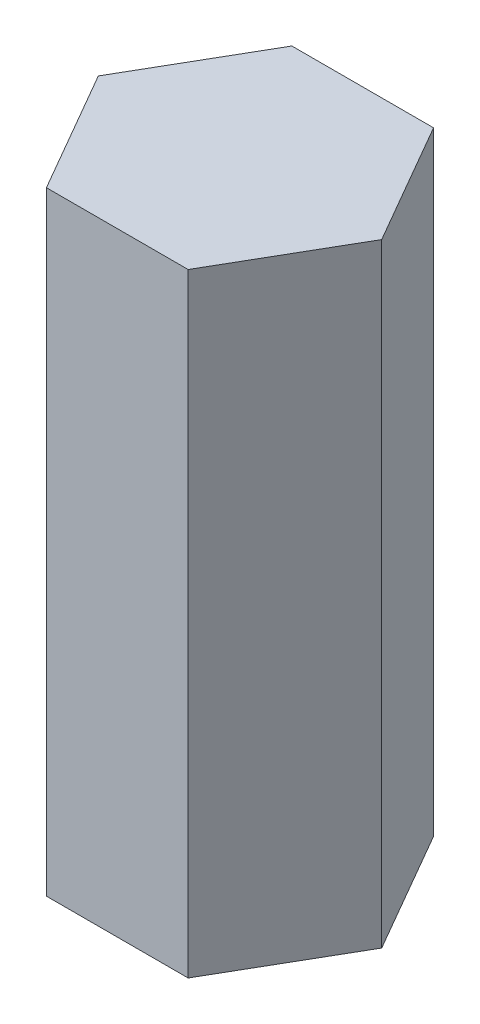
ISO-10303-21;
HEADER;
FILE_DESCRIPTION(('STEP AP214'),'2;1');
FILE_NAME('part.step','',(''),(''),'','','');
FILE_SCHEMA(('AUTOMOTIVE_DESIGN { 1 0 10303 214 1 1 1 1 }'));
ENDSEC;
DATA;
#1=APPLICATION_CONTEXT('core data for automotive mechanical design processes');
#2=APPLICATION_PROTOCOL_DEFINITION('international standard','automotive_design',2000,#1);
#3=PRODUCT_CONTEXT('',#1,'mechanical');
#4=PRODUCT('Part','Part','',(#3));
#5=PRODUCT_RELATED_PRODUCT_CATEGORY('part','',(#4));
#6=PRODUCT_DEFINITION_FORMATION('','',#4);
#7=PRODUCT_DEFINITION_CONTEXT('part definition',#1,'design');
#8=PRODUCT_DEFINITION('design','',#6,#7);
#9=PRODUCT_DEFINITION_SHAPE('','',#8);
#10=(LENGTH_UNIT() NAMED_UNIT(*) SI_UNIT(.MILLI.,.METRE.));
#11=(NAMED_UNIT(*) PLANE_ANGLE_UNIT() SI_UNIT($,.RADIAN.));
#12=(NAMED_UNIT(*) SI_UNIT($,.STERADIAN.) SOLID_ANGLE_UNIT());
#13=UNCERTAINTY_MEASURE_WITH_UNIT(LENGTH_MEASURE(1.E-05),#10,'distance_accuracy_value','');
#14=(GEOMETRIC_REPRESENTATION_CONTEXT(3) GLOBAL_UNCERTAINTY_ASSIGNED_CONTEXT((#13)) GLOBAL_UNIT_ASSIGNED_CONTEXT((#10,
#11,#12)) REPRESENTATION_CONTEXT('',''));
#15=CARTESIAN_POINT('',(0.,0.,0.));
#16=DIRECTION('',(0.,0.,1.));
#17=DIRECTION('',(1.,0.,0.));
#18=AXIS2_PLACEMENT_3D('',#15,#16,#17);
#19=CARTESIAN_POINT('',(3.46410161513775,15.,0.));
#20=DIRECTION('',(-0.866025403784439,0.,0.5));
#21=DIRECTION('',(0.5,0.,0.866025403784439));
#22=AXIS2_PLACEMENT_3D('',#19,#20,#21);
#23=PLANE('',#22);
#24=DIRECTION('',(-0.5,0.,-0.866025403784439));
#25=VECTOR('',#24,1.);
#26=CARTESIAN_POINT('',(3.46410161513775,0.,0.));
#27=LINE('',#26,#25);
#28=CARTESIAN_POINT('',(3.46410161513775,0.,0.));
#29=VERTEX_POINT('',#28);
#30=CARTESIAN_POINT('',(1.73205080756888,0.,-3.));
#31=VERTEX_POINT('',#30);
#32=EDGE_CURVE('E117',#29,#31,#27,.T.);
#33=ORIENTED_EDGE('',*,*,#32,.T.);
#34=DIRECTION('',(0.,-1.,0.));
#35=VECTOR('',#34,1.);
#36=CARTESIAN_POINT('',(1.73205080756888,15.,-3.));
#37=LINE('',#36,#35);
#38=CARTESIAN_POINT('',(1.73205080756888,15.,-3.));
#39=VERTEX_POINT('',#38);
#40=EDGE_CURVE('E11',#39,#31,#37,.T.);
#41=ORIENTED_EDGE('',*,*,#40,.F.);
#42=DIRECTION('',(-0.5,0.,-0.866025403784439));
#43=VECTOR('',#42,1.);
#44=CARTESIAN_POINT('',(3.46410161513775,15.,0.));
#45=LINE('',#44,#43);
#46=CARTESIAN_POINT('',(3.46410161513775,15.,0.));
#47=VERTEX_POINT('',#46);
#48=EDGE_CURVE('E127',#47,#39,#45,.T.);
#49=ORIENTED_EDGE('',*,*,#48,.F.);
#50=DIRECTION('',(0.,-1.,0.));
#51=VECTOR('',#50,1.);
#52=CARTESIAN_POINT('',(3.46410161513775,15.,0.));
#53=LINE('',#52,#51);
#54=EDGE_CURVE('E113',#47,#29,#53,.T.);
#55=ORIENTED_EDGE('',*,*,#54,.T.);
#56=EDGE_LOOP('',(#33,#41,#49,#55));
#57=FACE_BOUND('',#56,.T.);
#58=ADVANCED_FACE('F33',(#57),#23,.F.);
#59=CARTESIAN_POINT('',(1.73205080756888,15.,-3.));
#60=DIRECTION('',(0.,0.,1.));
#61=DIRECTION('',(1.,0.,0.));
#62=AXIS2_PLACEMENT_3D('',#59,#60,#61);
#63=PLANE('',#62);
#64=DIRECTION('',(-1.,0.,0.));
#65=VECTOR('',#64,1.);
#66=CARTESIAN_POINT('',(1.73205080756888,0.,-3.));
#67=LINE('',#66,#65);
#68=CARTESIAN_POINT('',(-1.73205080756888,0.,-3.));
#69=VERTEX_POINT('',#68);
#70=EDGE_CURVE('E120',#31,#69,#67,.T.);
#71=ORIENTED_EDGE('',*,*,#70,.T.);
#72=DIRECTION('',(0.,-1.,0.));
#73=VECTOR('',#72,1.);
#74=CARTESIAN_POINT('',(-1.73205080756888,15.,-3.));
#75=LINE('',#74,#73);
#76=CARTESIAN_POINT('',(-1.73205080756888,15.,-3.));
#77=VERTEX_POINT('',#76);
#78=EDGE_CURVE('E41',#77,#69,#75,.T.);
#79=ORIENTED_EDGE('',*,*,#78,.F.);
#80=DIRECTION('',(-1.,0.,0.));
#81=VECTOR('',#80,1.);
#82=CARTESIAN_POINT('',(1.73205080756888,15.,-3.));
#83=LINE('',#82,#81);
#84=EDGE_CURVE('E86',#39,#77,#83,.T.);
#85=ORIENTED_EDGE('',*,*,#84,.F.);
#86=ORIENTED_EDGE('',*,*,#40,.T.);
#87=EDGE_LOOP('',(#71,#79,#85,#86));
#88=FACE_BOUND('',#87,.T.);
#89=ADVANCED_FACE('F151',(#88),#63,.F.);
#90=CARTESIAN_POINT('',(-1.73205080756888,15.,-3.));
#91=DIRECTION('',(0.866025403784438,0.,0.5));
#92=DIRECTION('',(0.5,0.,-0.866025403784438));
#93=AXIS2_PLACEMENT_3D('',#90,#91,#92);
#94=PLANE('',#93);
#95=DIRECTION('',(-0.5,0.,0.866025403784438));
#96=VECTOR('',#95,1.);
#97=CARTESIAN_POINT('',(-1.73205080756888,0.,-3.));
#98=LINE('',#97,#96);
#99=CARTESIAN_POINT('',(-3.46410161513775,0.,0.));
#100=VERTEX_POINT('',#99);
#101=EDGE_CURVE('E122',#69,#100,#98,.T.);
#102=ORIENTED_EDGE('',*,*,#101,.T.);
#103=DIRECTION('',(0.,-1.,0.));
#104=VECTOR('',#103,1.);
#105=CARTESIAN_POINT('',(-3.46410161513775,15.,0.));
#106=LINE('',#105,#104);
#107=CARTESIAN_POINT('',(-3.46410161513775,15.,0.));
#108=VERTEX_POINT('',#107);
#109=EDGE_CURVE('E108',#108,#100,#106,.T.);
#110=ORIENTED_EDGE('',*,*,#109,.F.);
#111=DIRECTION('',(-0.5,0.,0.866025403784438));
#112=VECTOR('',#111,1.);
#113=CARTESIAN_POINT('',(-1.73205080756888,15.,-3.));
#114=LINE('',#113,#112);
#115=EDGE_CURVE('E99',#77,#108,#114,.T.);
#116=ORIENTED_EDGE('',*,*,#115,.F.);
#117=ORIENTED_EDGE('',*,*,#78,.T.);
#118=EDGE_LOOP('',(#102,#110,#116,#117));
#119=FACE_BOUND('',#118,.T.);
#120=ADVANCED_FACE('F133',(#119),#94,.F.);
#121=CARTESIAN_POINT('',(-3.46410161513775,15.,0.));
#122=DIRECTION('',(0.866025403784439,0.,-0.5));
#123=DIRECTION('',(-0.5,0.,-0.866025403784439));
#124=AXIS2_PLACEMENT_3D('',#121,#122,#123);
#125=PLANE('',#124);
#126=DIRECTION('',(0.5,0.,0.866025403784439));
#127=VECTOR('',#126,1.);
#128=CARTESIAN_POINT('',(-3.46410161513775,0.,0.));
#129=LINE('',#128,#127);
#130=CARTESIAN_POINT('',(-1.73205080756888,0.,3.));
#131=VERTEX_POINT('',#130);
#132=EDGE_CURVE('E107',#100,#131,#129,.T.);
#133=ORIENTED_EDGE('',*,*,#132,.T.);
#134=DIRECTION('',(0.,-1.,0.));
#135=VECTOR('',#134,1.);
#136=CARTESIAN_POINT('',(-1.73205080756888,15.,3.));
#137=LINE('',#136,#135);
#138=CARTESIAN_POINT('',(-1.73205080756888,15.,3.));
#139=VERTEX_POINT('',#138);
#140=EDGE_CURVE('E104',#139,#131,#137,.T.);
#141=ORIENTED_EDGE('',*,*,#140,.F.);
#142=DIRECTION('',(0.5,0.,0.866025403784439));
#143=VECTOR('',#142,1.);
#144=CARTESIAN_POINT('',(-3.46410161513775,15.,0.));
#145=LINE('',#144,#143);
#146=EDGE_CURVE('E93',#108,#139,#145,.T.);
#147=ORIENTED_EDGE('',*,*,#146,.F.);
#148=ORIENTED_EDGE('',*,*,#109,.T.);
#149=EDGE_LOOP('',(#133,#141,#147,#148));
#150=FACE_BOUND('',#149,.T.);
#151=ADVANCED_FACE('F105',(#150),#125,.F.);
#152=CARTESIAN_POINT('',(-1.73205080756888,15.,3.));
#153=DIRECTION('',(0.,0.,-1.));
#154=DIRECTION('',(-1.,0.,0.));
#155=AXIS2_PLACEMENT_3D('',#152,#153,#154);
#156=PLANE('',#155);
#157=DIRECTION('',(1.,0.,0.));
#158=VECTOR('',#157,1.);
#159=CARTESIAN_POINT('',(-1.73205080756888,0.,3.));
#160=LINE('',#159,#158);
#161=CARTESIAN_POINT('',(1.73205080756888,0.,3.));
#162=VERTEX_POINT('',#161);
#163=EDGE_CURVE('E72',#131,#162,#160,.T.);
#164=ORIENTED_EDGE('',*,*,#163,.T.);
#165=DIRECTION('',(0.,-1.,0.));
#166=VECTOR('',#165,1.);
#167=CARTESIAN_POINT('',(1.73205080756888,15.,3.));
#168=LINE('',#167,#166);
#169=CARTESIAN_POINT('',(1.73205080756888,15.,3.));
#170=VERTEX_POINT('',#169);
#171=EDGE_CURVE('E109',#170,#162,#168,.T.);
#172=ORIENTED_EDGE('',*,*,#171,.F.);
#173=DIRECTION('',(1.,0.,0.));
#174=VECTOR('',#173,1.);
#175=CARTESIAN_POINT('',(-1.73205080756888,15.,3.));
#176=LINE('',#175,#174);
#177=EDGE_CURVE('E97',#139,#170,#176,.T.);
#178=ORIENTED_EDGE('',*,*,#177,.F.);
#179=ORIENTED_EDGE('',*,*,#140,.T.);
#180=EDGE_LOOP('',(#164,#172,#178,#179));
#181=FACE_BOUND('',#180,.T.);
#182=ADVANCED_FACE('F111',(#181),#156,.F.);
#183=CARTESIAN_POINT('',(1.73205080756888,15.,3.));
#184=DIRECTION('',(-0.866025403784438,0.,-0.5));
#185=DIRECTION('',(-0.5,0.,0.866025403784439));
#186=AXIS2_PLACEMENT_3D('',#183,#184,#185);
#187=PLANE('',#186);
#188=DIRECTION('',(0.5,0.,-0.866025403784438));
#189=VECTOR('',#188,1.);
#190=CARTESIAN_POINT('',(1.73205080756888,0.,3.));
#191=LINE('',#190,#189);
#192=EDGE_CURVE('E78',#162,#29,#191,.T.);
#193=ORIENTED_EDGE('',*,*,#192,.T.);
#194=ORIENTED_EDGE('',*,*,#54,.F.);
#195=DIRECTION('',(0.5,0.,-0.866025403784438));
#196=VECTOR('',#195,1.);
#197=CARTESIAN_POINT('',(1.73205080756888,15.,3.));
#198=LINE('',#197,#196);
#199=EDGE_CURVE('E49',#170,#47,#198,.T.);
#200=ORIENTED_EDGE('',*,*,#199,.F.);
#201=ORIENTED_EDGE('',*,*,#171,.T.);
#202=EDGE_LOOP('',(#193,#194,#200,#201));
#203=FACE_BOUND('',#202,.T.);
#204=ADVANCED_FACE('F140',(#203),#187,.F.);
#205=CARTESIAN_POINT('',(0.,15.,0.));
#206=DIRECTION('',(0.,1.,0.));
#207=DIRECTION('',(0.,0.,1.));
#208=AXIS2_PLACEMENT_3D('',#205,#206,#207);
#209=PLANE('',#208);
#210=ORIENTED_EDGE('',*,*,#48,.T.);
#211=ORIENTED_EDGE('',*,*,#84,.T.);
#212=ORIENTED_EDGE('',*,*,#115,.T.);
#213=ORIENTED_EDGE('',*,*,#146,.T.);
#214=ORIENTED_EDGE('',*,*,#177,.T.);
#215=ORIENTED_EDGE('',*,*,#199,.T.);
#216=EDGE_LOOP('',(#210,#211,#212,#213,#214,#215));
#217=FACE_BOUND('',#216,.T.);
#218=ADVANCED_FACE('F95',(#217),#209,.T.);
#219=CARTESIAN_POINT('',(0.,0.,0.));
#220=DIRECTION('',(0.,1.,0.));
#221=DIRECTION('',(0.,0.,1.));
#222=AXIS2_PLACEMENT_3D('',#219,#220,#221);
#223=PLANE('',#222);
#224=ORIENTED_EDGE('',*,*,#32,.F.);
#225=ORIENTED_EDGE('',*,*,#192,.F.);
#226=ORIENTED_EDGE('',*,*,#163,.F.);
#227=ORIENTED_EDGE('',*,*,#132,.F.);
#228=ORIENTED_EDGE('',*,*,#101,.F.);
#229=ORIENTED_EDGE('',*,*,#70,.F.);
#230=EDGE_LOOP('',(#224,#225,#226,#227,#228,#229));
#231=FACE_BOUND('',#230,.T.);
#232=ADVANCED_FACE('F136',(#231),#223,.F.);
#233=CLOSED_SHELL('',(#58,#89,#120,#151,#182,#204,#218,#232));
#234=MANIFOLD_SOLID_BREP('B2',#233);
#235=ADVANCED_BREP_SHAPE_REPRESENTATION('',(#18,#234),#14);
#236=SHAPE_DEFINITION_REPRESENTATION(#9,#235);
ENDSEC;
END-ISO-10303-21;
